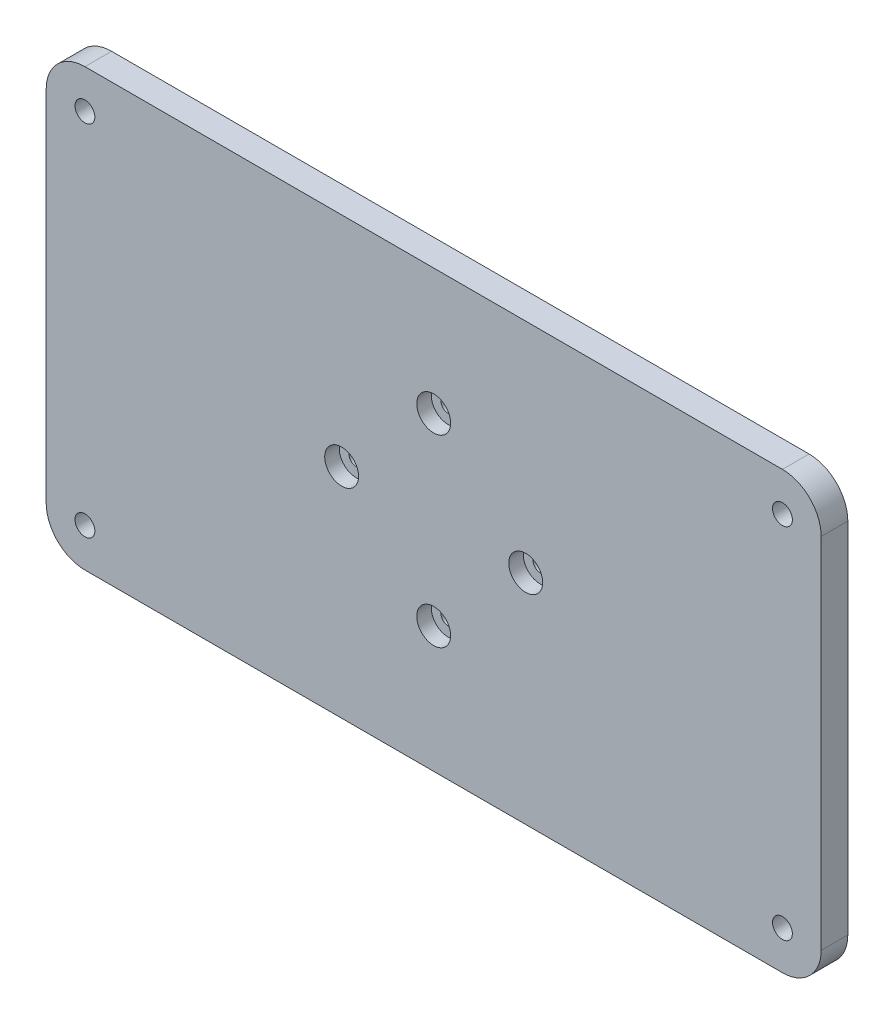
ISO-10303-21;
HEADER;
FILE_DESCRIPTION(('STEP AP214'),'2;1');
FILE_NAME('part.step','',(''),(''),'','','');
FILE_SCHEMA(('AUTOMOTIVE_DESIGN { 1 0 10303 214 1 1 1 1 }'));
ENDSEC;
DATA;
#1=APPLICATION_CONTEXT('core data for automotive mechanical design processes');
#2=APPLICATION_PROTOCOL_DEFINITION('international standard','automotive_design',2000,#1);
#3=PRODUCT_CONTEXT('',#1,'mechanical');
#4=PRODUCT('Part','Part','',(#3));
#5=PRODUCT_RELATED_PRODUCT_CATEGORY('part','',(#4));
#6=PRODUCT_DEFINITION_FORMATION('','',#4);
#7=PRODUCT_DEFINITION_CONTEXT('part definition',#1,'design');
#8=PRODUCT_DEFINITION('design','',#6,#7);
#9=PRODUCT_DEFINITION_SHAPE('','',#8);
#10=(LENGTH_UNIT() NAMED_UNIT(*) SI_UNIT(.MILLI.,.METRE.));
#11=(NAMED_UNIT(*) PLANE_ANGLE_UNIT() SI_UNIT($,.RADIAN.));
#12=(NAMED_UNIT(*) SI_UNIT($,.STERADIAN.) SOLID_ANGLE_UNIT());
#13=UNCERTAINTY_MEASURE_WITH_UNIT(LENGTH_MEASURE(1.E-05),#10,'distance_accuracy_value','');
#14=(GEOMETRIC_REPRESENTATION_CONTEXT(3) GLOBAL_UNCERTAINTY_ASSIGNED_CONTEXT((#13)) GLOBAL_UNIT_ASSIGNED_CONTEXT((#10,
#11,#12)) REPRESENTATION_CONTEXT('',''));
#15=CARTESIAN_POINT('',(0.,0.,0.));
#16=DIRECTION('',(0.,0.,1.));
#17=DIRECTION('',(1.,0.,0.));
#18=AXIS2_PLACEMENT_3D('',#15,#16,#17);
#19=CARTESIAN_POINT('',(0.,19.,3.));
#20=DIRECTION('',(0.,0.,-1.));
#21=DIRECTION('',(-1.,0.,0.));
#22=AXIS2_PLACEMENT_3D('',#19,#20,#21);
#23=CYLINDRICAL_SURFACE('',#22,1.5);
#24=CARTESIAN_POINT('',(0.,19.,3.));
#25=DIRECTION('',(0.,0.,1.));
#26=DIRECTION('',(1.,0.,0.));
#27=AXIS2_PLACEMENT_3D('',#24,#25,#26);
#28=CIRCLE('',#27,1.5);
#29=CARTESIAN_POINT('',(1.5,19.,3.));
#30=VERTEX_POINT('',#29);
#31=EDGE_CURVE('E315',#30,#30,#28,.T.);
#32=ORIENTED_EDGE('',*,*,#31,.F.);
#33=EDGE_LOOP('',(#32));
#34=FACE_BOUND('',#33,.T.);
#35=CARTESIAN_POINT('',(0.,19.,5.5));
#36=DIRECTION('',(0.,0.,1.));
#37=DIRECTION('',(1.,0.,0.));
#38=AXIS2_PLACEMENT_3D('',#35,#36,#37);
#39=CIRCLE('',#38,1.5);
#40=CARTESIAN_POINT('',(1.5,19.,5.5));
#41=VERTEX_POINT('',#40);
#42=EDGE_CURVE('E49',#41,#41,#39,.T.);
#43=ORIENTED_EDGE('',*,*,#42,.T.);
#44=EDGE_LOOP('',(#43));
#45=FACE_BOUND('',#44,.T.);
#46=ADVANCED_FACE('F45',(#34,#45),#23,.F.);
#47=CARTESIAN_POINT('',(19.,0.,3.));
#48=DIRECTION('',(0.,0.,-1.));
#49=DIRECTION('',(-1.,0.,0.));
#50=AXIS2_PLACEMENT_3D('',#47,#48,#49);
#51=CYLINDRICAL_SURFACE('',#50,1.5);
#52=CARTESIAN_POINT('',(19.,0.,3.));
#53=DIRECTION('',(0.,0.,1.));
#54=DIRECTION('',(1.,0.,0.));
#55=AXIS2_PLACEMENT_3D('',#52,#53,#54);
#56=CIRCLE('',#55,1.5);
#57=CARTESIAN_POINT('',(20.5,0.,3.));
#58=VERTEX_POINT('',#57);
#59=EDGE_CURVE('E323',#58,#58,#56,.T.);
#60=ORIENTED_EDGE('',*,*,#59,.F.);
#61=EDGE_LOOP('',(#60));
#62=FACE_BOUND('',#61,.T.);
#63=CARTESIAN_POINT('',(19.,0.,5.5));
#64=DIRECTION('',(0.,0.,1.));
#65=DIRECTION('',(1.,0.,0.));
#66=AXIS2_PLACEMENT_3D('',#63,#64,#65);
#67=CIRCLE('',#66,1.5);
#68=CARTESIAN_POINT('',(20.5,0.,5.5));
#69=VERTEX_POINT('',#68);
#70=EDGE_CURVE('E193',#69,#69,#67,.T.);
#71=ORIENTED_EDGE('',*,*,#70,.T.);
#72=EDGE_LOOP('',(#71));
#73=FACE_BOUND('',#72,.T.);
#74=ADVANCED_FACE('F258',(#62,#73),#51,.F.);
#75=CARTESIAN_POINT('',(0.,-19.,3.));
#76=DIRECTION('',(0.,0.,-1.));
#77=DIRECTION('',(-1.,0.,0.));
#78=AXIS2_PLACEMENT_3D('',#75,#76,#77);
#79=CYLINDRICAL_SURFACE('',#78,1.5);
#80=CARTESIAN_POINT('',(0.,-19.,3.));
#81=DIRECTION('',(0.,0.,1.));
#82=DIRECTION('',(1.,0.,0.));
#83=AXIS2_PLACEMENT_3D('',#80,#81,#82);
#84=CIRCLE('',#83,1.5);
#85=CARTESIAN_POINT('',(1.5,-19.,3.));
#86=VERTEX_POINT('',#85);
#87=EDGE_CURVE('E301',#86,#86,#84,.T.);
#88=ORIENTED_EDGE('',*,*,#87,.F.);
#89=EDGE_LOOP('',(#88));
#90=FACE_BOUND('',#89,.T.);
#91=CARTESIAN_POINT('',(0.,-19.,5.5));
#92=DIRECTION('',(0.,0.,1.));
#93=DIRECTION('',(1.,0.,0.));
#94=AXIS2_PLACEMENT_3D('',#91,#92,#93);
#95=CIRCLE('',#94,1.5);
#96=CARTESIAN_POINT('',(1.5,-19.,5.5));
#97=VERTEX_POINT('',#96);
#98=EDGE_CURVE('E190',#97,#97,#95,.T.);
#99=ORIENTED_EDGE('',*,*,#98,.T.);
#100=EDGE_LOOP('',(#99));
#101=FACE_BOUND('',#100,.T.);
#102=ADVANCED_FACE('F264',(#90,#101),#79,.F.);
#103=CARTESIAN_POINT('',(-19.,0.,3.));
#104=DIRECTION('',(0.,0.,-1.));
#105=DIRECTION('',(-1.,0.,0.));
#106=AXIS2_PLACEMENT_3D('',#103,#104,#105);
#107=CYLINDRICAL_SURFACE('',#106,1.5);
#108=CARTESIAN_POINT('',(-19.,0.,3.));
#109=DIRECTION('',(0.,0.,1.));
#110=DIRECTION('',(1.,0.,0.));
#111=AXIS2_PLACEMENT_3D('',#108,#109,#110);
#112=CIRCLE('',#111,1.5);
#113=CARTESIAN_POINT('',(-17.5,0.,3.));
#114=VERTEX_POINT('',#113);
#115=EDGE_CURVE('E452',#114,#114,#112,.T.);
#116=ORIENTED_EDGE('',*,*,#115,.F.);
#117=EDGE_LOOP('',(#116));
#118=FACE_BOUND('',#117,.T.);
#119=CARTESIAN_POINT('',(-19.,0.,5.5));
#120=DIRECTION('',(0.,0.,1.));
#121=DIRECTION('',(1.,0.,0.));
#122=AXIS2_PLACEMENT_3D('',#119,#120,#121);
#123=CIRCLE('',#122,1.5);
#124=CARTESIAN_POINT('',(-17.5,0.,5.5));
#125=VERTEX_POINT('',#124);
#126=EDGE_CURVE('E420',#125,#125,#123,.T.);
#127=ORIENTED_EDGE('',*,*,#126,.T.);
#128=EDGE_LOOP('',(#127));
#129=FACE_BOUND('',#128,.T.);
#130=ADVANCED_FACE('F287',(#118,#129),#107,.F.);
#131=CARTESIAN_POINT('',(80.,0.,8.5));
#132=DIRECTION('',(1.,0.,0.));
#133=DIRECTION('',(0.,0.,-1.));
#134=AXIS2_PLACEMENT_3D('',#131,#132,#133);
#135=PLANE('',#134);
#136=DIRECTION('',(0.,-1.,0.));
#137=VECTOR('',#136,1.);
#138=CARTESIAN_POINT('',(80.,0.,3.));
#139=LINE('',#138,#137);
#140=CARTESIAN_POINT('',(80.,37.,3.));
#141=VERTEX_POINT('',#140);
#142=CARTESIAN_POINT('',(80.,-37.,3.));
#143=VERTEX_POINT('',#142);
#144=EDGE_CURVE('E220',#141,#143,#139,.T.);
#145=ORIENTED_EDGE('',*,*,#144,.F.);
#146=DIRECTION('',(0.,0.,-1.));
#147=VECTOR('',#146,1.);
#148=CARTESIAN_POINT('',(80.,37.,8.5));
#149=LINE('',#148,#147);
#150=CARTESIAN_POINT('',(80.,37.,8.5));
#151=VERTEX_POINT('',#150);
#152=EDGE_CURVE('E11',#141,#151,#149,.F.);
#153=ORIENTED_EDGE('',*,*,#152,.T.);
#154=DIRECTION('',(0.,-1.,0.));
#155=VECTOR('',#154,1.);
#156=CARTESIAN_POINT('',(80.,0.,8.5));
#157=LINE('',#156,#155);
#158=CARTESIAN_POINT('',(80.,-37.,8.5));
#159=VERTEX_POINT('',#158);
#160=EDGE_CURVE('E144',#151,#159,#157,.T.);
#161=ORIENTED_EDGE('',*,*,#160,.T.);
#162=DIRECTION('',(0.,0.,-1.));
#163=VECTOR('',#162,1.);
#164=CARTESIAN_POINT('',(80.,-37.,3.));
#165=LINE('',#164,#163);
#166=EDGE_CURVE('E55',#159,#143,#165,.T.);
#167=ORIENTED_EDGE('',*,*,#166,.T.);
#168=EDGE_LOOP('',(#145,#153,#161,#167));
#169=FACE_BOUND('',#168,.T.);
#170=ADVANCED_FACE('F255',(#169),#135,.T.);
#171=CARTESIAN_POINT('',(0.,45.,8.5));
#172=DIRECTION('',(0.,1.,0.));
#173=DIRECTION('',(0.,0.,1.));
#174=AXIS2_PLACEMENT_3D('',#171,#172,#173);
#175=PLANE('',#174);
#176=DIRECTION('',(1.,0.,0.));
#177=VECTOR('',#176,1.);
#178=CARTESIAN_POINT('',(0.,45.,3.));
#179=LINE('',#178,#177);
#180=CARTESIAN_POINT('',(-72.,45.,3.));
#181=VERTEX_POINT('',#180);
#182=CARTESIAN_POINT('',(72.,45.,3.));
#183=VERTEX_POINT('',#182);
#184=EDGE_CURVE('E152',#181,#183,#179,.T.);
#185=ORIENTED_EDGE('',*,*,#184,.F.);
#186=DIRECTION('',(0.,0.,-1.));
#187=VECTOR('',#186,1.);
#188=CARTESIAN_POINT('',(-72.,45.,8.5));
#189=LINE('',#188,#187);
#190=CARTESIAN_POINT('',(-72.,45.,8.5));
#191=VERTEX_POINT('',#190);
#192=EDGE_CURVE('E70',#181,#191,#189,.F.);
#193=ORIENTED_EDGE('',*,*,#192,.T.);
#194=DIRECTION('',(1.,0.,0.));
#195=VECTOR('',#194,1.);
#196=CARTESIAN_POINT('',(0.,45.,8.5));
#197=LINE('',#196,#195);
#198=CARTESIAN_POINT('',(72.,45.,8.5));
#199=VERTEX_POINT('',#198);
#200=EDGE_CURVE('E150',#191,#199,#197,.T.);
#201=ORIENTED_EDGE('',*,*,#200,.T.);
#202=DIRECTION('',(0.,0.,-1.));
#203=VECTOR('',#202,1.);
#204=CARTESIAN_POINT('',(72.,45.,8.5));
#205=LINE('',#204,#203);
#206=EDGE_CURVE('E181',#199,#183,#205,.T.);
#207=ORIENTED_EDGE('',*,*,#206,.T.);
#208=EDGE_LOOP('',(#185,#193,#201,#207));
#209=FACE_BOUND('',#208,.T.);
#210=ADVANCED_FACE('F238',(#209),#175,.T.);
#211=CARTESIAN_POINT('',(-80.,0.,8.5));
#212=DIRECTION('',(1.,0.,0.));
#213=DIRECTION('',(0.,0.,-1.));
#214=AXIS2_PLACEMENT_3D('',#211,#212,#213);
#215=PLANE('',#214);
#216=DIRECTION('',(0.,-1.,0.));
#217=VECTOR('',#216,1.);
#218=CARTESIAN_POINT('',(-80.,0.,3.));
#219=LINE('',#218,#217);
#220=CARTESIAN_POINT('',(-80.,37.,3.));
#221=VERTEX_POINT('',#220);
#222=CARTESIAN_POINT('',(-80.,-37.,3.));
#223=VERTEX_POINT('',#222);
#224=EDGE_CURVE('E145',#221,#223,#219,.T.);
#225=ORIENTED_EDGE('',*,*,#224,.T.);
#226=DIRECTION('',(0.,0.,-1.));
#227=VECTOR('',#226,1.);
#228=CARTESIAN_POINT('',(-80.,-37.,8.5));
#229=LINE('',#228,#227);
#230=CARTESIAN_POINT('',(-80.,-37.,8.5));
#231=VERTEX_POINT('',#230);
#232=EDGE_CURVE('E119',#223,#231,#229,.F.);
#233=ORIENTED_EDGE('',*,*,#232,.T.);
#234=DIRECTION('',(0.,-1.,0.));
#235=VECTOR('',#234,1.);
#236=CARTESIAN_POINT('',(-80.,0.,8.5));
#237=LINE('',#236,#235);
#238=CARTESIAN_POINT('',(-80.,37.,8.5));
#239=VERTEX_POINT('',#238);
#240=EDGE_CURVE('E228',#239,#231,#237,.T.);
#241=ORIENTED_EDGE('',*,*,#240,.F.);
#242=DIRECTION('',(0.,0.,-1.));
#243=VECTOR('',#242,1.);
#244=CARTESIAN_POINT('',(-80.,37.,3.));
#245=LINE('',#244,#243);
#246=EDGE_CURVE('E125',#239,#221,#245,.T.);
#247=ORIENTED_EDGE('',*,*,#246,.T.);
#248=EDGE_LOOP('',(#225,#233,#241,#247));
#249=FACE_BOUND('',#248,.T.);
#250=ADVANCED_FACE('F247',(#249),#215,.F.);
#251=CARTESIAN_POINT('',(0.,-45.,8.5));
#252=DIRECTION('',(0.,1.,0.));
#253=DIRECTION('',(0.,0.,1.));
#254=AXIS2_PLACEMENT_3D('',#251,#252,#253);
#255=PLANE('',#254);
#256=DIRECTION('',(1.,0.,0.));
#257=VECTOR('',#256,1.);
#258=CARTESIAN_POINT('',(0.,-45.,8.5));
#259=LINE('',#258,#257);
#260=CARTESIAN_POINT('',(-72.,-45.,8.5));
#261=VERTEX_POINT('',#260);
#262=CARTESIAN_POINT('',(72.,-45.,8.5));
#263=VERTEX_POINT('',#262);
#264=EDGE_CURVE('E135',#261,#263,#259,.T.);
#265=ORIENTED_EDGE('',*,*,#264,.F.);
#266=DIRECTION('',(0.,0.,-1.));
#267=VECTOR('',#266,1.);
#268=CARTESIAN_POINT('',(-72.,-45.,8.5));
#269=LINE('',#268,#267);
#270=CARTESIAN_POINT('',(-72.,-45.,3.));
#271=VERTEX_POINT('',#270);
#272=EDGE_CURVE('E118',#261,#271,#269,.T.);
#273=ORIENTED_EDGE('',*,*,#272,.T.);
#274=DIRECTION('',(1.,0.,0.));
#275=VECTOR('',#274,1.);
#276=CARTESIAN_POINT('',(0.,-45.,3.));
#277=LINE('',#276,#275);
#278=CARTESIAN_POINT('',(72.,-45.,3.));
#279=VERTEX_POINT('',#278);
#280=EDGE_CURVE('E132',#271,#279,#277,.T.);
#281=ORIENTED_EDGE('',*,*,#280,.T.);
#282=DIRECTION('',(0.,0.,-1.));
#283=VECTOR('',#282,1.);
#284=CARTESIAN_POINT('',(72.,-45.,8.5));
#285=LINE('',#284,#283);
#286=EDGE_CURVE('E138',#279,#263,#285,.F.);
#287=ORIENTED_EDGE('',*,*,#286,.T.);
#288=EDGE_LOOP('',(#265,#273,#281,#287));
#289=FACE_BOUND('',#288,.T.);
#290=ADVANCED_FACE('F131',(#289),#255,.F.);
#291=CARTESIAN_POINT('',(0.,0.,8.5));
#292=DIRECTION('',(0.,0.,1.));
#293=DIRECTION('',(1.,0.,0.));
#294=AXIS2_PLACEMENT_3D('',#291,#292,#293);
#295=PLANE('',#294);
#296=CARTESIAN_POINT('',(-19.,0.,8.5));
#297=DIRECTION('',(0.,0.,1.));
#298=DIRECTION('',(1.,0.,0.));
#299=AXIS2_PLACEMENT_3D('',#296,#297,#298);
#300=CIRCLE('',#299,3.5);
#301=CARTESIAN_POINT('',(-15.5,0.,8.5));
#302=VERTEX_POINT('',#301);
#303=EDGE_CURVE('E377',#302,#302,#300,.T.);
#304=ORIENTED_EDGE('',*,*,#303,.F.);
#305=EDGE_LOOP('',(#304));
#306=FACE_BOUND('',#305,.T.);
#307=CARTESIAN_POINT('',(0.,19.,8.5));
#308=DIRECTION('',(0.,0.,1.));
#309=DIRECTION('',(1.,0.,0.));
#310=AXIS2_PLACEMENT_3D('',#307,#308,#309);
#311=CIRCLE('',#310,3.5);
#312=CARTESIAN_POINT('',(3.5,19.,8.5));
#313=VERTEX_POINT('',#312);
#314=EDGE_CURVE('E381',#313,#313,#311,.T.);
#315=ORIENTED_EDGE('',*,*,#314,.F.);
#316=EDGE_LOOP('',(#315));
#317=FACE_BOUND('',#316,.T.);
#318=CARTESIAN_POINT('',(19.,0.,8.5));
#319=DIRECTION('',(0.,0.,1.));
#320=DIRECTION('',(1.,0.,0.));
#321=AXIS2_PLACEMENT_3D('',#318,#319,#320);
#322=CIRCLE('',#321,3.5);
#323=CARTESIAN_POINT('',(22.5,0.,8.5));
#324=VERTEX_POINT('',#323);
#325=EDGE_CURVE('E385',#324,#324,#322,.T.);
#326=ORIENTED_EDGE('',*,*,#325,.F.);
#327=EDGE_LOOP('',(#326));
#328=FACE_BOUND('',#327,.T.);
#329=CARTESIAN_POINT('',(0.,-19.,8.5));
#330=DIRECTION('',(0.,0.,1.));
#331=DIRECTION('',(1.,0.,0.));
#332=AXIS2_PLACEMENT_3D('',#329,#330,#331);
#333=CIRCLE('',#332,3.5);
#334=CARTESIAN_POINT('',(3.5,-19.,8.5));
#335=VERTEX_POINT('',#334);
#336=EDGE_CURVE('E314',#335,#335,#333,.T.);
#337=ORIENTED_EDGE('',*,*,#336,.F.);
#338=EDGE_LOOP('',(#337));
#339=FACE_BOUND('',#338,.T.);
#340=CARTESIAN_POINT('',(72.,-37.,8.5));
#341=DIRECTION('',(0.,0.,-1.));
#342=DIRECTION('',(-1.,0.,0.));
#343=AXIS2_PLACEMENT_3D('',#340,#341,#342);
#344=CIRCLE('',#343,2.04999999999999);
#345=CARTESIAN_POINT('',(69.95,-37.,8.5));
#346=VERTEX_POINT('',#345);
#347=EDGE_CURVE('E201',#346,#346,#344,.T.);
#348=ORIENTED_EDGE('',*,*,#347,.T.);
#349=EDGE_LOOP('',(#348));
#350=FACE_BOUND('',#349,.T.);
#351=CARTESIAN_POINT('',(-72.,-37.,8.5));
#352=DIRECTION('',(0.,0.,-1.));
#353=DIRECTION('',(-1.,0.,0.));
#354=AXIS2_PLACEMENT_3D('',#351,#352,#353);
#355=CIRCLE('',#354,2.04999999999999);
#356=CARTESIAN_POINT('',(-74.05,-37.,8.5));
#357=VERTEX_POINT('',#356);
#358=EDGE_CURVE('E212',#357,#357,#355,.T.);
#359=ORIENTED_EDGE('',*,*,#358,.T.);
#360=EDGE_LOOP('',(#359));
#361=FACE_BOUND('',#360,.T.);
#362=CARTESIAN_POINT('',(-72.,37.,8.5));
#363=DIRECTION('',(0.,0.,-1.));
#364=DIRECTION('',(-1.,0.,0.));
#365=AXIS2_PLACEMENT_3D('',#362,#363,#364);
#366=CIRCLE('',#365,2.04999999999999);
#367=CARTESIAN_POINT('',(-74.05,37.,8.5));
#368=VERTEX_POINT('',#367);
#369=EDGE_CURVE('E330',#368,#368,#366,.T.);
#370=ORIENTED_EDGE('',*,*,#369,.T.);
#371=EDGE_LOOP('',(#370));
#372=FACE_BOUND('',#371,.T.);
#373=CARTESIAN_POINT('',(72.,37.,8.5));
#374=DIRECTION('',(0.,0.,-1.));
#375=DIRECTION('',(-1.,0.,0.));
#376=AXIS2_PLACEMENT_3D('',#373,#374,#375);
#377=CIRCLE('',#376,2.04999999999999);
#378=CARTESIAN_POINT('',(69.95,37.,8.5));
#379=VERTEX_POINT('',#378);
#380=EDGE_CURVE('E216',#379,#379,#377,.T.);
#381=ORIENTED_EDGE('',*,*,#380,.T.);
#382=EDGE_LOOP('',(#381));
#383=FACE_BOUND('',#382,.T.);
#384=ORIENTED_EDGE('',*,*,#240,.T.);
#385=CARTESIAN_POINT('',(-72.,-37.,8.5));
#386=DIRECTION('',(0.,0.,1.));
#387=DIRECTION('',(1.,0.,0.));
#388=AXIS2_PLACEMENT_3D('',#385,#386,#387);
#389=CIRCLE('',#388,8.);
#390=EDGE_CURVE('E178',#231,#261,#389,.T.);
#391=ORIENTED_EDGE('',*,*,#390,.T.);
#392=ORIENTED_EDGE('',*,*,#264,.T.);
#393=CARTESIAN_POINT('',(72.,-37.,8.5));
#394=DIRECTION('',(0.,0.,1.));
#395=DIRECTION('',(1.,0.,0.));
#396=AXIS2_PLACEMENT_3D('',#393,#394,#395);
#397=CIRCLE('',#396,8.);
#398=EDGE_CURVE('E170',#263,#159,#397,.T.);
#399=ORIENTED_EDGE('',*,*,#398,.T.);
#400=ORIENTED_EDGE('',*,*,#160,.F.);
#401=CARTESIAN_POINT('',(72.,37.,8.5));
#402=DIRECTION('',(0.,0.,1.));
#403=DIRECTION('',(1.,0.,0.));
#404=AXIS2_PLACEMENT_3D('',#401,#402,#403);
#405=CIRCLE('',#404,8.);
#406=EDGE_CURVE('E63',#151,#199,#405,.T.);
#407=ORIENTED_EDGE('',*,*,#406,.T.);
#408=ORIENTED_EDGE('',*,*,#200,.F.);
#409=CARTESIAN_POINT('',(-72.,37.,8.5));
#410=DIRECTION('',(0.,0.,1.));
#411=DIRECTION('',(1.,0.,0.));
#412=AXIS2_PLACEMENT_3D('',#409,#410,#411);
#413=CIRCLE('',#412,8.);
#414=EDGE_CURVE('E175',#191,#239,#413,.T.);
#415=ORIENTED_EDGE('',*,*,#414,.T.);
#416=EDGE_LOOP('',(#384,#391,#392,#399,#400,#407,#408,#415));
#417=FACE_BOUND('',#416,.T.);
#418=ADVANCED_FACE('F245',(#306,#317,#328,#339,#350,#361,#372,#383,#417),#295,.T.);
#419=CARTESIAN_POINT('',(0.,0.,3.));
#420=DIRECTION('',(0.,0.,1.));
#421=DIRECTION('',(1.,0.,0.));
#422=AXIS2_PLACEMENT_3D('',#419,#420,#421);
#423=PLANE('',#422);
#424=CARTESIAN_POINT('',(72.,-37.,3.));
#425=DIRECTION('',(0.,0.,-1.));
#426=DIRECTION('',(-1.,0.,0.));
#427=AXIS2_PLACEMENT_3D('',#424,#425,#426);
#428=CIRCLE('',#427,2.04999999999999);
#429=CARTESIAN_POINT('',(69.95,-37.,3.));
#430=VERTEX_POINT('',#429);
#431=EDGE_CURVE('E206',#430,#430,#428,.T.);
#432=ORIENTED_EDGE('',*,*,#431,.F.);
#433=EDGE_LOOP('',(#432));
#434=FACE_BOUND('',#433,.T.);
#435=CARTESIAN_POINT('',(-72.,-37.,3.));
#436=DIRECTION('',(0.,0.,-1.));
#437=DIRECTION('',(-1.,0.,0.));
#438=AXIS2_PLACEMENT_3D('',#435,#436,#437);
#439=CIRCLE('',#438,2.04999999999999);
#440=CARTESIAN_POINT('',(-74.05,-37.,3.));
#441=VERTEX_POINT('',#440);
#442=EDGE_CURVE('E334',#441,#441,#439,.T.);
#443=ORIENTED_EDGE('',*,*,#442,.F.);
#444=EDGE_LOOP('',(#443));
#445=FACE_BOUND('',#444,.T.);
#446=CARTESIAN_POINT('',(-72.,37.,3.));
#447=DIRECTION('',(0.,0.,-1.));
#448=DIRECTION('',(-1.,0.,0.));
#449=AXIS2_PLACEMENT_3D('',#446,#447,#448);
#450=CIRCLE('',#449,2.04999999999999);
#451=CARTESIAN_POINT('',(-74.05,37.,3.));
#452=VERTEX_POINT('',#451);
#453=EDGE_CURVE('E224',#452,#452,#450,.T.);
#454=ORIENTED_EDGE('',*,*,#453,.F.);
#455=EDGE_LOOP('',(#454));
#456=FACE_BOUND('',#455,.T.);
#457=CARTESIAN_POINT('',(72.,37.,3.));
#458=DIRECTION('',(0.,0.,-1.));
#459=DIRECTION('',(-1.,0.,0.));
#460=AXIS2_PLACEMENT_3D('',#457,#458,#459);
#461=CIRCLE('',#460,2.04999999999999);
#462=CARTESIAN_POINT('',(69.95,37.,3.));
#463=VERTEX_POINT('',#462);
#464=EDGE_CURVE('E221',#463,#463,#461,.T.);
#465=ORIENTED_EDGE('',*,*,#464,.F.);
#466=EDGE_LOOP('',(#465));
#467=FACE_BOUND('',#466,.T.);
#468=ORIENTED_EDGE('',*,*,#280,.F.);
#469=CARTESIAN_POINT('',(-72.,-37.,3.));
#470=DIRECTION('',(0.,0.,1.));
#471=DIRECTION('',(1.,0.,0.));
#472=AXIS2_PLACEMENT_3D('',#469,#470,#471);
#473=CIRCLE('',#472,8.);
#474=EDGE_CURVE('E114',#271,#223,#473,.F.);
#475=ORIENTED_EDGE('',*,*,#474,.T.);
#476=ORIENTED_EDGE('',*,*,#224,.F.);
#477=CARTESIAN_POINT('',(-72.,37.,3.));
#478=DIRECTION('',(0.,0.,1.));
#479=DIRECTION('',(1.,0.,0.));
#480=AXIS2_PLACEMENT_3D('',#477,#478,#479);
#481=CIRCLE('',#480,8.);
#482=EDGE_CURVE('E126',#221,#181,#481,.F.);
#483=ORIENTED_EDGE('',*,*,#482,.T.);
#484=ORIENTED_EDGE('',*,*,#184,.T.);
#485=CARTESIAN_POINT('',(72.,37.,3.));
#486=DIRECTION('',(0.,0.,1.));
#487=DIRECTION('',(1.,0.,0.));
#488=AXIS2_PLACEMENT_3D('',#485,#486,#487);
#489=CIRCLE('',#488,8.);
#490=EDGE_CURVE('E160',#183,#141,#489,.F.);
#491=ORIENTED_EDGE('',*,*,#490,.T.);
#492=ORIENTED_EDGE('',*,*,#144,.T.);
#493=CARTESIAN_POINT('',(72.,-37.,3.));
#494=DIRECTION('',(0.,0.,1.));
#495=DIRECTION('',(1.,0.,0.));
#496=AXIS2_PLACEMENT_3D('',#493,#494,#495);
#497=CIRCLE('',#496,8.);
#498=EDGE_CURVE('E137',#143,#279,#497,.F.);
#499=ORIENTED_EDGE('',*,*,#498,.T.);
#500=EDGE_LOOP('',(#468,#475,#476,#483,#484,#491,#492,#499));
#501=FACE_BOUND('',#500,.T.);
#502=ORIENTED_EDGE('',*,*,#31,.T.);
#503=EDGE_LOOP('',(#502));
#504=FACE_BOUND('',#503,.T.);
#505=ORIENTED_EDGE('',*,*,#59,.T.);
#506=EDGE_LOOP('',(#505));
#507=FACE_BOUND('',#506,.T.);
#508=ORIENTED_EDGE('',*,*,#87,.T.);
#509=EDGE_LOOP('',(#508));
#510=FACE_BOUND('',#509,.T.);
#511=ORIENTED_EDGE('',*,*,#115,.T.);
#512=EDGE_LOOP('',(#511));
#513=FACE_BOUND('',#512,.T.);
#514=ADVANCED_FACE('F140',(#434,#445,#456,#467,#501,#504,#507,#510,#513),#423,.F.);
#515=CARTESIAN_POINT('',(72.,37.,8.5));
#516=DIRECTION('',(0.,0.,-1.));
#517=DIRECTION('',(-1.,0.,0.));
#518=AXIS2_PLACEMENT_3D('',#515,#516,#517);
#519=CYLINDRICAL_SURFACE('',#518,2.04999999999999);
#520=ORIENTED_EDGE('',*,*,#380,.F.);
#521=EDGE_LOOP('',(#520));
#522=FACE_BOUND('',#521,.T.);
#523=ORIENTED_EDGE('',*,*,#464,.T.);
#524=EDGE_LOOP('',(#523));
#525=FACE_BOUND('',#524,.T.);
#526=ADVANCED_FACE('F352',(#522,#525),#519,.F.);
#527=CARTESIAN_POINT('',(-72.,37.,8.5));
#528=DIRECTION('',(0.,0.,-1.));
#529=DIRECTION('',(-1.,0.,0.));
#530=AXIS2_PLACEMENT_3D('',#527,#528,#529);
#531=CYLINDRICAL_SURFACE('',#530,2.04999999999999);
#532=ORIENTED_EDGE('',*,*,#369,.F.);
#533=EDGE_LOOP('',(#532));
#534=FACE_BOUND('',#533,.T.);
#535=ORIENTED_EDGE('',*,*,#453,.T.);
#536=EDGE_LOOP('',(#535));
#537=FACE_BOUND('',#536,.T.);
#538=ADVANCED_FACE('F346',(#534,#537),#531,.F.);
#539=CARTESIAN_POINT('',(-72.,-37.,8.5));
#540=DIRECTION('',(0.,0.,-1.));
#541=DIRECTION('',(-1.,0.,0.));
#542=AXIS2_PLACEMENT_3D('',#539,#540,#541);
#543=CYLINDRICAL_SURFACE('',#542,2.04999999999999);
#544=ORIENTED_EDGE('',*,*,#358,.F.);
#545=EDGE_LOOP('',(#544));
#546=FACE_BOUND('',#545,.T.);
#547=ORIENTED_EDGE('',*,*,#442,.T.);
#548=EDGE_LOOP('',(#547));
#549=FACE_BOUND('',#548,.T.);
#550=ADVANCED_FACE('F343',(#546,#549),#543,.F.);
#551=CARTESIAN_POINT('',(72.,-37.,8.5));
#552=DIRECTION('',(0.,0.,-1.));
#553=DIRECTION('',(-1.,0.,0.));
#554=AXIS2_PLACEMENT_3D('',#551,#552,#553);
#555=CYLINDRICAL_SURFACE('',#554,2.04999999999999);
#556=ORIENTED_EDGE('',*,*,#347,.F.);
#557=EDGE_LOOP('',(#556));
#558=FACE_BOUND('',#557,.T.);
#559=ORIENTED_EDGE('',*,*,#431,.T.);
#560=EDGE_LOOP('',(#559));
#561=FACE_BOUND('',#560,.T.);
#562=ADVANCED_FACE('F272',(#558,#561),#555,.F.);
#563=CARTESIAN_POINT('',(-72.,-37.,8.5));
#564=DIRECTION('',(0.,0.,-1.));
#565=DIRECTION('',(-1.,0.,0.));
#566=AXIS2_PLACEMENT_3D('',#563,#564,#565);
#567=CYLINDRICAL_SURFACE('',#566,8.);
#568=ORIENTED_EDGE('',*,*,#390,.F.);
#569=ORIENTED_EDGE('',*,*,#232,.F.);
#570=ORIENTED_EDGE('',*,*,#474,.F.);
#571=ORIENTED_EDGE('',*,*,#272,.F.);
#572=EDGE_LOOP('',(#568,#569,#570,#571));
#573=FACE_BOUND('',#572,.T.);
#574=ADVANCED_FACE('F117',(#573),#567,.T.);
#575=CARTESIAN_POINT('',(-72.,37.,8.5));
#576=DIRECTION('',(0.,0.,1.));
#577=DIRECTION('',(1.,0.,0.));
#578=AXIS2_PLACEMENT_3D('',#575,#576,#577);
#579=CYLINDRICAL_SURFACE('',#578,8.);
#580=ORIENTED_EDGE('',*,*,#414,.F.);
#581=ORIENTED_EDGE('',*,*,#192,.F.);
#582=ORIENTED_EDGE('',*,*,#482,.F.);
#583=ORIENTED_EDGE('',*,*,#246,.F.);
#584=EDGE_LOOP('',(#580,#581,#582,#583));
#585=FACE_BOUND('',#584,.T.);
#586=ADVANCED_FACE('F242',(#585),#579,.T.);
#587=CARTESIAN_POINT('',(72.,37.,8.5));
#588=DIRECTION('',(0.,0.,-1.));
#589=DIRECTION('',(-1.,0.,0.));
#590=AXIS2_PLACEMENT_3D('',#587,#588,#589);
#591=CYLINDRICAL_SURFACE('',#590,8.);
#592=ORIENTED_EDGE('',*,*,#406,.F.);
#593=ORIENTED_EDGE('',*,*,#152,.F.);
#594=ORIENTED_EDGE('',*,*,#490,.F.);
#595=ORIENTED_EDGE('',*,*,#206,.F.);
#596=EDGE_LOOP('',(#592,#593,#594,#595));
#597=FACE_BOUND('',#596,.T.);
#598=ADVANCED_FACE('F274',(#597),#591,.T.);
#599=CARTESIAN_POINT('',(72.,-37.,8.5));
#600=DIRECTION('',(0.,0.,1.));
#601=DIRECTION('',(1.,0.,0.));
#602=AXIS2_PLACEMENT_3D('',#599,#600,#601);
#603=CYLINDRICAL_SURFACE('',#602,8.);
#604=ORIENTED_EDGE('',*,*,#398,.F.);
#605=ORIENTED_EDGE('',*,*,#286,.F.);
#606=ORIENTED_EDGE('',*,*,#498,.F.);
#607=ORIENTED_EDGE('',*,*,#166,.F.);
#608=EDGE_LOOP('',(#604,#605,#606,#607));
#609=FACE_BOUND('',#608,.T.);
#610=ADVANCED_FACE('F47',(#609),#603,.T.);
#611=CARTESIAN_POINT('',(0.,-19.,5.5));
#612=DIRECTION('',(0.,0.,1.));
#613=DIRECTION('',(1.,0.,0.));
#614=AXIS2_PLACEMENT_3D('',#611,#612,#613);
#615=CYLINDRICAL_SURFACE('',#614,3.5);
#616=CARTESIAN_POINT('',(0.,-19.,5.5));
#617=DIRECTION('',(0.,0.,1.));
#618=DIRECTION('',(1.,0.,0.));
#619=AXIS2_PLACEMENT_3D('',#616,#617,#618);
#620=CIRCLE('',#619,3.5);
#621=CARTESIAN_POINT('',(3.5,-19.,5.5));
#622=VERTEX_POINT('',#621);
#623=EDGE_CURVE('E311',#622,#622,#620,.T.);
#624=ORIENTED_EDGE('',*,*,#623,.F.);
#625=EDGE_LOOP('',(#624));
#626=FACE_BOUND('',#625,.T.);
#627=ORIENTED_EDGE('',*,*,#336,.T.);
#628=EDGE_LOOP('',(#627));
#629=FACE_BOUND('',#628,.T.);
#630=ADVANCED_FACE('F280',(#626,#629),#615,.F.);
#631=CARTESIAN_POINT('',(0.,-19.,5.5));
#632=DIRECTION('',(0.,0.,1.));
#633=DIRECTION('',(1.,0.,0.));
#634=AXIS2_PLACEMENT_3D('',#631,#632,#633);
#635=PLANE('',#634);
#636=ORIENTED_EDGE('',*,*,#98,.F.);
#637=EDGE_LOOP('',(#636));
#638=FACE_BOUND('',#637,.T.);
#639=ORIENTED_EDGE('',*,*,#623,.T.);
#640=EDGE_LOOP('',(#639));
#641=FACE_BOUND('',#640,.T.);
#642=ADVANCED_FACE('F304',(#638,#641),#635,.T.);
#643=CARTESIAN_POINT('',(19.,0.,5.5));
#644=DIRECTION('',(0.,0.,1.));
#645=DIRECTION('',(1.,0.,0.));
#646=AXIS2_PLACEMENT_3D('',#643,#644,#645);
#647=CYLINDRICAL_SURFACE('',#646,3.5);
#648=CARTESIAN_POINT('',(19.,0.,5.5));
#649=DIRECTION('',(0.,0.,1.));
#650=DIRECTION('',(1.,0.,0.));
#651=AXIS2_PLACEMENT_3D('',#648,#649,#650);
#652=CIRCLE('',#651,3.5);
#653=CARTESIAN_POINT('',(22.5,0.,5.5));
#654=VERTEX_POINT('',#653);
#655=EDGE_CURVE('E320',#654,#654,#652,.T.);
#656=ORIENTED_EDGE('',*,*,#655,.F.);
#657=EDGE_LOOP('',(#656));
#658=FACE_BOUND('',#657,.T.);
#659=ORIENTED_EDGE('',*,*,#325,.T.);
#660=EDGE_LOOP('',(#659));
#661=FACE_BOUND('',#660,.T.);
#662=ADVANCED_FACE('F307',(#658,#661),#647,.F.);
#663=CARTESIAN_POINT('',(19.,0.,5.5));
#664=DIRECTION('',(0.,0.,1.));
#665=DIRECTION('',(1.,0.,0.));
#666=AXIS2_PLACEMENT_3D('',#663,#664,#665);
#667=PLANE('',#666);
#668=ORIENTED_EDGE('',*,*,#70,.F.);
#669=EDGE_LOOP('',(#668));
#670=FACE_BOUND('',#669,.T.);
#671=ORIENTED_EDGE('',*,*,#655,.T.);
#672=EDGE_LOOP('',(#671));
#673=FACE_BOUND('',#672,.T.);
#674=ADVANCED_FACE('F393',(#670,#673),#667,.T.);
#675=CARTESIAN_POINT('',(0.,19.,5.5));
#676=DIRECTION('',(0.,0.,1.));
#677=DIRECTION('',(1.,0.,0.));
#678=AXIS2_PLACEMENT_3D('',#675,#676,#677);
#679=CYLINDRICAL_SURFACE('',#678,3.5);
#680=CARTESIAN_POINT('',(0.,19.,5.5));
#681=DIRECTION('',(0.,0.,1.));
#682=DIRECTION('',(1.,0.,0.));
#683=AXIS2_PLACEMENT_3D('',#680,#681,#682);
#684=CIRCLE('',#683,3.5);
#685=CARTESIAN_POINT('',(3.5,19.,5.5));
#686=VERTEX_POINT('',#685);
#687=EDGE_CURVE('E431',#686,#686,#684,.T.);
#688=ORIENTED_EDGE('',*,*,#687,.F.);
#689=EDGE_LOOP('',(#688));
#690=FACE_BOUND('',#689,.T.);
#691=ORIENTED_EDGE('',*,*,#314,.T.);
#692=EDGE_LOOP('',(#691));
#693=FACE_BOUND('',#692,.T.);
#694=ADVANCED_FACE('F396',(#690,#693),#679,.F.);
#695=CARTESIAN_POINT('',(0.,19.,5.5));
#696=DIRECTION('',(0.,0.,1.));
#697=DIRECTION('',(1.,0.,0.));
#698=AXIS2_PLACEMENT_3D('',#695,#696,#697);
#699=PLANE('',#698);
#700=ORIENTED_EDGE('',*,*,#42,.F.);
#701=EDGE_LOOP('',(#700));
#702=FACE_BOUND('',#701,.T.);
#703=ORIENTED_EDGE('',*,*,#687,.T.);
#704=EDGE_LOOP('',(#703));
#705=FACE_BOUND('',#704,.T.);
#706=ADVANCED_FACE('F401',(#702,#705),#699,.T.);
#707=CARTESIAN_POINT('',(-19.,0.,5.5));
#708=DIRECTION('',(0.,0.,1.));
#709=DIRECTION('',(1.,0.,0.));
#710=AXIS2_PLACEMENT_3D('',#707,#708,#709);
#711=CYLINDRICAL_SURFACE('',#710,3.5);
#712=CARTESIAN_POINT('',(-19.,0.,5.5));
#713=DIRECTION('',(0.,0.,1.));
#714=DIRECTION('',(1.,0.,0.));
#715=AXIS2_PLACEMENT_3D('',#712,#713,#714);
#716=CIRCLE('',#715,3.5);
#717=CARTESIAN_POINT('',(-15.5,0.,5.5));
#718=VERTEX_POINT('',#717);
#719=EDGE_CURVE('E194',#718,#718,#716,.T.);
#720=ORIENTED_EDGE('',*,*,#719,.F.);
#721=EDGE_LOOP('',(#720));
#722=FACE_BOUND('',#721,.T.);
#723=ORIENTED_EDGE('',*,*,#303,.T.);
#724=EDGE_LOOP('',(#723));
#725=FACE_BOUND('',#724,.T.);
#726=ADVANCED_FACE('F404',(#722,#725),#711,.F.);
#727=CARTESIAN_POINT('',(-19.,0.,5.5));
#728=DIRECTION('',(0.,0.,1.));
#729=DIRECTION('',(1.,0.,0.));
#730=AXIS2_PLACEMENT_3D('',#727,#728,#729);
#731=PLANE('',#730);
#732=ORIENTED_EDGE('',*,*,#126,.F.);
#733=EDGE_LOOP('',(#732));
#734=FACE_BOUND('',#733,.T.);
#735=ORIENTED_EDGE('',*,*,#719,.T.);
#736=EDGE_LOOP('',(#735));
#737=FACE_BOUND('',#736,.T.);
#738=ADVANCED_FACE('F411',(#734,#737),#731,.T.);
#739=CLOSED_SHELL('',(#46,#74,#102,#130,#170,#210,#250,#290,#418,#514,#526,#538,#550,#562,#574,
#586,#598,#610,#630,#642,#662,#674,#694,#706,#726,#738));
#740=MANIFOLD_SOLID_BREP('B2',#739);
#741=ADVANCED_BREP_SHAPE_REPRESENTATION('',(#18,#740),#14);
#742=SHAPE_DEFINITION_REPRESENTATION(#9,#741);
ENDSEC;
END-ISO-10303-21;
